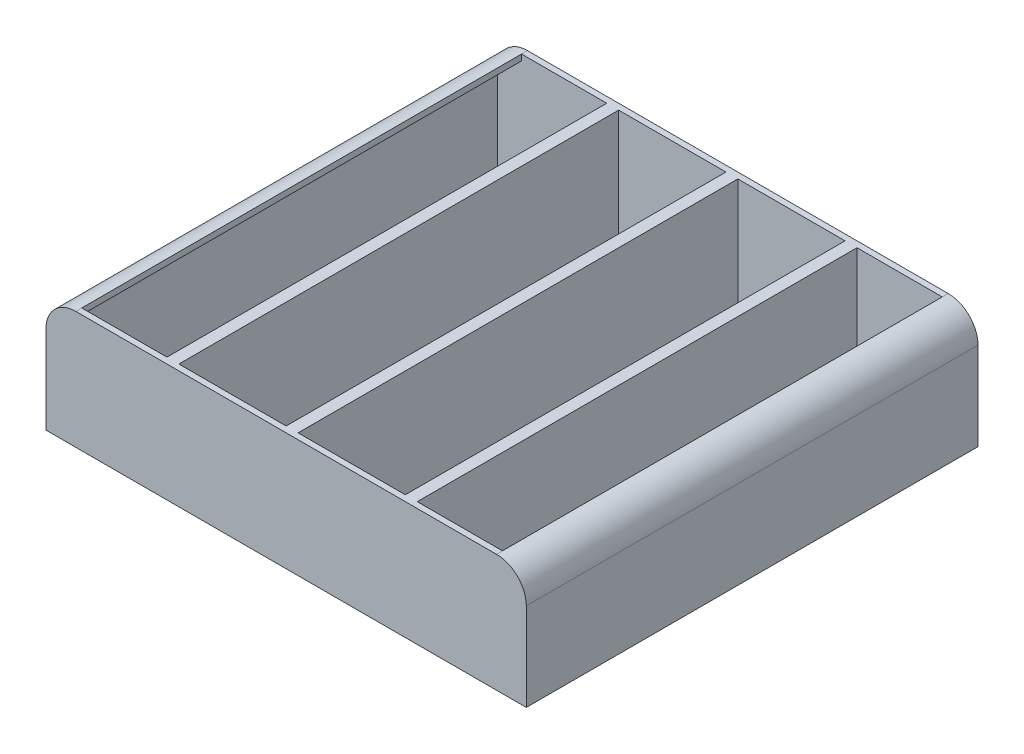
ISO-10303-21;
HEADER;
FILE_DESCRIPTION(('STEP AP214'),'2;1');
FILE_NAME('part.step','',(''),(''),'','','');
FILE_SCHEMA(('AUTOMOTIVE_DESIGN { 1 0 10303 214 1 1 1 1 }'));
ENDSEC;
DATA;
#1=APPLICATION_CONTEXT('core data for automotive mechanical design processes');
#2=APPLICATION_PROTOCOL_DEFINITION('international standard','automotive_design',2000,#1);
#3=PRODUCT_CONTEXT('',#1,'mechanical');
#4=PRODUCT('Part','Part','',(#3));
#5=PRODUCT_RELATED_PRODUCT_CATEGORY('part','',(#4));
#6=PRODUCT_DEFINITION_FORMATION('','',#4);
#7=PRODUCT_DEFINITION_CONTEXT('part definition',#1,'design');
#8=PRODUCT_DEFINITION('design','',#6,#7);
#9=PRODUCT_DEFINITION_SHAPE('','',#8);
#10=(LENGTH_UNIT() NAMED_UNIT(*) SI_UNIT(.MILLI.,.METRE.));
#11=(NAMED_UNIT(*) PLANE_ANGLE_UNIT() SI_UNIT($,.RADIAN.));
#12=(NAMED_UNIT(*) SI_UNIT($,.STERADIAN.) SOLID_ANGLE_UNIT());
#13=UNCERTAINTY_MEASURE_WITH_UNIT(LENGTH_MEASURE(1.E-05),#10,'distance_accuracy_value','');
#14=(GEOMETRIC_REPRESENTATION_CONTEXT(3) GLOBAL_UNCERTAINTY_ASSIGNED_CONTEXT((#13)) GLOBAL_UNIT_ASSIGNED_CONTEXT((#10,
#11,#12)) REPRESENTATION_CONTEXT('',''));
#15=CARTESIAN_POINT('',(0.,0.,0.));
#16=DIRECTION('',(0.,0.,1.));
#17=DIRECTION('',(1.,0.,0.));
#18=AXIS2_PLACEMENT_3D('',#15,#16,#17);
#19=CARTESIAN_POINT('',(-40.3,19.76,-37.9));
#20=DIRECTION('',(0.,0.,1.));
#21=DIRECTION('',(1.,0.,0.));
#22=AXIS2_PLACEMENT_3D('',#19,#20,#21);
#23=PLANE('',#22);
#24=DIRECTION('',(-1.,0.,0.));
#25=VECTOR('',#24,1.);
#26=CARTESIAN_POINT('',(-40.3,19.76,-37.9));
#27=LINE('',#26,#25);
#28=CARTESIAN_POINT('',(35.3,19.76,-37.9));
#29=VERTEX_POINT('',#28);
#30=CARTESIAN_POINT('',(-35.3,19.76,-37.9));
#31=VERTEX_POINT('',#30);
#32=EDGE_CURVE('E411',#29,#31,#27,.T.);
#33=ORIENTED_EDGE('',*,*,#32,.F.);
#34=CARTESIAN_POINT('',(35.3,14.76,-37.9));
#35=DIRECTION('',(0.,0.,1.));
#36=DIRECTION('',(1.,0.,0.));
#37=AXIS2_PLACEMENT_3D('',#34,#35,#36);
#38=CIRCLE('',#37,5.);
#39=CARTESIAN_POINT('',(40.3,14.76,-37.9));
#40=VERTEX_POINT('',#39);
#41=EDGE_CURVE('E273',#29,#40,#38,.F.);
#42=ORIENTED_EDGE('',*,*,#41,.T.);
#43=DIRECTION('',(0.,-1.,0.));
#44=VECTOR('',#43,1.);
#45=CARTESIAN_POINT('',(40.3,19.76,-37.9));
#46=LINE('',#45,#44);
#47=CARTESIAN_POINT('',(40.3,0.,-37.9));
#48=VERTEX_POINT('',#47);
#49=EDGE_CURVE('E279',#40,#48,#46,.T.);
#50=ORIENTED_EDGE('',*,*,#49,.T.);
#51=DIRECTION('',(-1.,0.,0.));
#52=VECTOR('',#51,1.);
#53=CARTESIAN_POINT('',(-40.3,0.,-37.9));
#54=LINE('',#53,#52);
#55=CARTESIAN_POINT('',(-40.3,0.,-37.9));
#56=VERTEX_POINT('',#55);
#57=EDGE_CURVE('E11',#48,#56,#54,.T.);
#58=ORIENTED_EDGE('',*,*,#57,.T.);
#59=DIRECTION('',(0.,-1.,0.));
#60=VECTOR('',#59,1.);
#61=CARTESIAN_POINT('',(-40.3,19.76,-37.9));
#62=LINE('',#61,#60);
#63=CARTESIAN_POINT('',(-40.3,14.76,-37.9));
#64=VERTEX_POINT('',#63);
#65=EDGE_CURVE('E404',#64,#56,#62,.T.);
#66=ORIENTED_EDGE('',*,*,#65,.F.);
#67=CARTESIAN_POINT('',(-35.3,14.76,-37.9));
#68=DIRECTION('',(0.,0.,1.));
#69=DIRECTION('',(1.,0.,0.));
#70=AXIS2_PLACEMENT_3D('',#67,#68,#69);
#71=CIRCLE('',#70,5.);
#72=EDGE_CURVE('E397',#64,#31,#71,.F.);
#73=ORIENTED_EDGE('',*,*,#72,.T.);
#74=EDGE_LOOP('',(#33,#42,#50,#58,#66,#73));
#75=FACE_BOUND('',#74,.T.);
#76=ADVANCED_FACE('F39',(#75),#23,.F.);
#77=CARTESIAN_POINT('',(-40.3,19.76,37.9));
#78=DIRECTION('',(0.,0.,-1.));
#79=DIRECTION('',(-1.,0.,0.));
#80=AXIS2_PLACEMENT_3D('',#77,#78,#79);
#81=PLANE('',#80);
#82=DIRECTION('',(1.,0.,0.));
#83=VECTOR('',#82,1.);
#84=CARTESIAN_POINT('',(-40.3,0.,37.9));
#85=LINE('',#84,#83);
#86=CARTESIAN_POINT('',(-40.3,0.,37.9));
#87=VERTEX_POINT('',#86);
#88=CARTESIAN_POINT('',(40.3,0.,37.9));
#89=VERTEX_POINT('',#88);
#90=EDGE_CURVE('E409',#87,#89,#85,.T.);
#91=ORIENTED_EDGE('',*,*,#90,.T.);
#92=DIRECTION('',(0.,-1.,0.));
#93=VECTOR('',#92,1.);
#94=CARTESIAN_POINT('',(40.3,19.76,37.9));
#95=LINE('',#94,#93);
#96=CARTESIAN_POINT('',(40.3,14.76,37.9));
#97=VERTEX_POINT('',#96);
#98=EDGE_CURVE('E281',#97,#89,#95,.T.);
#99=ORIENTED_EDGE('',*,*,#98,.F.);
#100=CARTESIAN_POINT('',(35.3,14.76,37.9));
#101=DIRECTION('',(0.,0.,-1.));
#102=DIRECTION('',(-1.,0.,0.));
#103=AXIS2_PLACEMENT_3D('',#100,#101,#102);
#104=CIRCLE('',#103,5.);
#105=CARTESIAN_POINT('',(35.3,19.76,37.9));
#106=VERTEX_POINT('',#105);
#107=EDGE_CURVE('E263',#97,#106,#104,.F.);
#108=ORIENTED_EDGE('',*,*,#107,.T.);
#109=DIRECTION('',(1.,0.,0.));
#110=VECTOR('',#109,1.);
#111=CARTESIAN_POINT('',(-40.3,19.76,37.9));
#112=LINE('',#111,#110);
#113=CARTESIAN_POINT('',(-35.3,19.76,37.9));
#114=VERTEX_POINT('',#113);
#115=EDGE_CURVE('E43',#114,#106,#112,.T.);
#116=ORIENTED_EDGE('',*,*,#115,.F.);
#117=CARTESIAN_POINT('',(-35.3,14.76,37.9));
#118=DIRECTION('',(0.,0.,-1.));
#119=DIRECTION('',(-1.,0.,0.));
#120=AXIS2_PLACEMENT_3D('',#117,#118,#119);
#121=CIRCLE('',#120,5.);
#122=CARTESIAN_POINT('',(-40.3,14.76,37.9));
#123=VERTEX_POINT('',#122);
#124=EDGE_CURVE('E395',#114,#123,#121,.F.);
#125=ORIENTED_EDGE('',*,*,#124,.T.);
#126=DIRECTION('',(0.,-1.,0.));
#127=VECTOR('',#126,1.);
#128=CARTESIAN_POINT('',(-40.3,19.76,37.9));
#129=LINE('',#128,#127);
#130=EDGE_CURVE('E406',#123,#87,#129,.T.);
#131=ORIENTED_EDGE('',*,*,#130,.T.);
#132=EDGE_LOOP('',(#91,#99,#108,#116,#125,#131));
#133=FACE_BOUND('',#132,.T.);
#134=ADVANCED_FACE('F424',(#133),#81,.F.);
#135=CARTESIAN_POINT('',(0.,19.76,0.));
#136=DIRECTION('',(0.,1.,0.));
#137=DIRECTION('',(0.,0.,1.));
#138=AXIS2_PLACEMENT_3D('',#135,#136,#137);
#139=PLANE('',#138);
#140=DIRECTION('',(1.,0.,0.));
#141=VECTOR('',#140,1.);
#142=CARTESIAN_POINT('',(-40.3,19.76,36.9));
#143=LINE('',#142,#141);
#144=CARTESIAN_POINT('',(-35.3,19.76,36.9));
#145=VERTEX_POINT('',#144);
#146=CARTESIAN_POINT('',(-21.,19.76,36.9));
#147=VERTEX_POINT('',#146);
#148=EDGE_CURVE('E381',#145,#147,#143,.T.);
#149=ORIENTED_EDGE('',*,*,#148,.F.);
#150=DIRECTION('',(0.,0.,1.));
#151=VECTOR('',#150,1.);
#152=CARTESIAN_POINT('',(-35.3,19.76,37.9));
#153=LINE('',#152,#151);
#154=EDGE_CURVE('E400',#145,#114,#153,.T.);
#155=ORIENTED_EDGE('',*,*,#154,.T.);
#156=ORIENTED_EDGE('',*,*,#115,.T.);
#157=DIRECTION('',(0.,0.,-1.));
#158=VECTOR('',#157,1.);
#159=CARTESIAN_POINT('',(35.3,19.76,-37.9));
#160=LINE('',#159,#158);
#161=CARTESIAN_POINT('',(35.3,19.76,36.9));
#162=VERTEX_POINT('',#161);
#163=EDGE_CURVE('E276',#106,#162,#160,.T.);
#164=ORIENTED_EDGE('',*,*,#163,.T.);
#165=DIRECTION('',(1.,0.,0.));
#166=VECTOR('',#165,1.);
#167=CARTESIAN_POINT('',(-40.3,19.76,36.9));
#168=LINE('',#167,#166);
#169=CARTESIAN_POINT('',(21.,19.76,36.9));
#170=VERTEX_POINT('',#169);
#171=EDGE_CURVE('E256',#170,#162,#168,.T.);
#172=ORIENTED_EDGE('',*,*,#171,.F.);
#173=DIRECTION('',(0.,0.,-1.));
#174=VECTOR('',#173,1.);
#175=CARTESIAN_POINT('',(21.,19.76,0.));
#176=LINE('',#175,#174);
#177=CARTESIAN_POINT('',(21.,19.76,-36.9));
#178=VERTEX_POINT('',#177);
#179=EDGE_CURVE('E233',#170,#178,#176,.T.);
#180=ORIENTED_EDGE('',*,*,#179,.T.);
#181=DIRECTION('',(-1.,0.,0.));
#182=VECTOR('',#181,1.);
#183=CARTESIAN_POINT('',(-40.3,19.76,-36.9));
#184=LINE('',#183,#182);
#185=CARTESIAN_POINT('',(35.3,19.76,-36.9));
#186=VERTEX_POINT('',#185);
#187=EDGE_CURVE('E231',#186,#178,#184,.T.);
#188=ORIENTED_EDGE('',*,*,#187,.F.);
#189=EDGE_CURVE('E275',#186,#29,#160,.T.);
#190=ORIENTED_EDGE('',*,*,#189,.T.);
#191=ORIENTED_EDGE('',*,*,#32,.T.);
#192=CARTESIAN_POINT('',(-35.3,19.76,-36.9));
#193=VERTEX_POINT('',#192);
#194=EDGE_CURVE('E401',#31,#193,#153,.T.);
#195=ORIENTED_EDGE('',*,*,#194,.T.);
#196=DIRECTION('',(-1.,0.,0.));
#197=VECTOR('',#196,1.);
#198=CARTESIAN_POINT('',(-40.3,19.76,-36.9));
#199=LINE('',#198,#197);
#200=CARTESIAN_POINT('',(-21.,19.76,-36.9));
#201=VERTEX_POINT('',#200);
#202=EDGE_CURVE('E375',#201,#193,#199,.T.);
#203=ORIENTED_EDGE('',*,*,#202,.F.);
#204=DIRECTION('',(0.,0.,-1.));
#205=VECTOR('',#204,1.);
#206=CARTESIAN_POINT('',(-21.,19.76,0.));
#207=LINE('',#206,#205);
#208=EDGE_CURVE('E362',#147,#201,#207,.T.);
#209=ORIENTED_EDGE('',*,*,#208,.F.);
#210=EDGE_LOOP('',(#149,#155,#156,#164,#172,#180,#188,#190,#191,#195,#203,#209));
#211=FACE_BOUND('',#210,.T.);
#212=DIRECTION('',(1.,0.,0.));
#213=VECTOR('',#212,1.);
#214=CARTESIAN_POINT('',(-40.3,19.76,36.9));
#215=LINE('',#214,#213);
#216=CARTESIAN_POINT('',(-19.,19.76,36.9));
#217=VERTEX_POINT('',#216);
#218=CARTESIAN_POINT('',(-1.,19.76,36.9));
#219=VERTEX_POINT('',#218);
#220=EDGE_CURVE('E325',#217,#219,#215,.T.);
#221=ORIENTED_EDGE('',*,*,#220,.F.);
#222=DIRECTION('',(0.,0.,-1.));
#223=VECTOR('',#222,1.);
#224=CARTESIAN_POINT('',(-19.,19.76,0.));
#225=LINE('',#224,#223);
#226=CARTESIAN_POINT('',(-19.,19.76,-36.9));
#227=VERTEX_POINT('',#226);
#228=EDGE_CURVE('E337',#217,#227,#225,.T.);
#229=ORIENTED_EDGE('',*,*,#228,.T.);
#230=DIRECTION('',(-1.,0.,0.));
#231=VECTOR('',#230,1.);
#232=CARTESIAN_POINT('',(-40.3,19.76,-36.9));
#233=LINE('',#232,#231);
#234=CARTESIAN_POINT('',(-1.,19.76,-36.9));
#235=VERTEX_POINT('',#234);
#236=EDGE_CURVE('E341',#235,#227,#233,.T.);
#237=ORIENTED_EDGE('',*,*,#236,.F.);
#238=DIRECTION('',(0.,0.,-1.));
#239=VECTOR('',#238,1.);
#240=CARTESIAN_POINT('',(-1.,19.76,0.));
#241=LINE('',#240,#239);
#242=EDGE_CURVE('E326',#219,#235,#241,.T.);
#243=ORIENTED_EDGE('',*,*,#242,.F.);
#244=EDGE_LOOP('',(#221,#229,#237,#243));
#245=FACE_BOUND('',#244,.T.);
#246=DIRECTION('',(1.,0.,0.));
#247=VECTOR('',#246,1.);
#248=CARTESIAN_POINT('',(-40.3,19.76,36.9));
#249=LINE('',#248,#247);
#250=CARTESIAN_POINT('',(1.,19.76,36.9));
#251=VERTEX_POINT('',#250);
#252=CARTESIAN_POINT('',(19.,19.76,36.9));
#253=VERTEX_POINT('',#252);
#254=EDGE_CURVE('E296',#251,#253,#249,.T.);
#255=ORIENTED_EDGE('',*,*,#254,.F.);
#256=DIRECTION('',(0.,0.,-1.));
#257=VECTOR('',#256,1.);
#258=CARTESIAN_POINT('',(1.,19.76,0.));
#259=LINE('',#258,#257);
#260=CARTESIAN_POINT('',(1.,19.76,-36.9));
#261=VERTEX_POINT('',#260);
#262=EDGE_CURVE('E306',#251,#261,#259,.T.);
#263=ORIENTED_EDGE('',*,*,#262,.T.);
#264=DIRECTION('',(-1.,0.,0.));
#265=VECTOR('',#264,1.);
#266=CARTESIAN_POINT('',(-40.3,19.76,-36.9));
#267=LINE('',#266,#265);
#268=CARTESIAN_POINT('',(19.,19.76,-36.9));
#269=VERTEX_POINT('',#268);
#270=EDGE_CURVE('E312',#269,#261,#267,.T.);
#271=ORIENTED_EDGE('',*,*,#270,.F.);
#272=DIRECTION('',(0.,0.,-1.));
#273=VECTOR('',#272,1.);
#274=CARTESIAN_POINT('',(19.,19.76,0.));
#275=LINE('',#274,#273);
#276=EDGE_CURVE('E295',#253,#269,#275,.T.);
#277=ORIENTED_EDGE('',*,*,#276,.F.);
#278=EDGE_LOOP('',(#255,#263,#271,#277));
#279=FACE_BOUND('',#278,.T.);
#280=ADVANCED_FACE('F41',(#211,#245,#279),#139,.T.);
#281=CARTESIAN_POINT('',(0.,0.,0.));
#282=DIRECTION('',(0.,1.,0.));
#283=DIRECTION('',(0.,0.,1.));
#284=AXIS2_PLACEMENT_3D('',#281,#282,#283);
#285=PLANE('',#284);
#286=ORIENTED_EDGE('',*,*,#57,.F.);
#287=DIRECTION('',(0.,0.,-1.));
#288=VECTOR('',#287,1.);
#289=CARTESIAN_POINT('',(40.3,0.,-37.9));
#290=LINE('',#289,#288);
#291=EDGE_CURVE('E284',#89,#48,#290,.T.);
#292=ORIENTED_EDGE('',*,*,#291,.F.);
#293=ORIENTED_EDGE('',*,*,#90,.F.);
#294=DIRECTION('',(0.,0.,1.));
#295=VECTOR('',#294,1.);
#296=CARTESIAN_POINT('',(-40.3,0.,-37.9));
#297=LINE('',#296,#295);
#298=EDGE_CURVE('E48',#56,#87,#297,.T.);
#299=ORIENTED_EDGE('',*,*,#298,.F.);
#300=EDGE_LOOP('',(#286,#292,#293,#299));
#301=FACE_BOUND('',#300,.T.);
#302=ADVANCED_FACE('F463',(#301),#285,.F.);
#303=CARTESIAN_POINT('',(-40.3,19.76,-37.9));
#304=DIRECTION('',(1.,0.,0.));
#305=DIRECTION('',(0.,0.,-1.));
#306=AXIS2_PLACEMENT_3D('',#303,#304,#305);
#307=PLANE('',#306);
#308=ORIENTED_EDGE('',*,*,#130,.F.);
#309=DIRECTION('',(0.,0.,1.));
#310=VECTOR('',#309,1.);
#311=CARTESIAN_POINT('',(-40.3,14.76,-37.9));
#312=LINE('',#311,#310);
#313=EDGE_CURVE('E386',#123,#64,#312,.F.);
#314=ORIENTED_EDGE('',*,*,#313,.T.);
#315=ORIENTED_EDGE('',*,*,#65,.T.);
#316=ORIENTED_EDGE('',*,*,#298,.T.);
#317=EDGE_LOOP('',(#308,#314,#315,#316));
#318=FACE_BOUND('',#317,.T.);
#319=ADVANCED_FACE('F461',(#318),#307,.F.);
#320=CARTESIAN_POINT('',(-35.3,14.76,0.));
#321=DIRECTION('',(0.,0.,-1.));
#322=DIRECTION('',(-1.,0.,0.));
#323=AXIS2_PLACEMENT_3D('',#320,#321,#322);
#324=CYLINDRICAL_SURFACE('',#323,5.);
#325=ORIENTED_EDGE('',*,*,#72,.F.);
#326=ORIENTED_EDGE('',*,*,#313,.F.);
#327=ORIENTED_EDGE('',*,*,#124,.F.);
#328=ORIENTED_EDGE('',*,*,#154,.F.);
#329=DIRECTION('',(0.,0.,1.));
#330=VECTOR('',#329,1.);
#331=CARTESIAN_POINT('',(-35.3,19.76,37.9));
#332=LINE('',#331,#330);
#333=EDGE_CURVE('E350',#193,#145,#332,.T.);
#334=ORIENTED_EDGE('',*,*,#333,.F.);
#335=ORIENTED_EDGE('',*,*,#194,.F.);
#336=EDGE_LOOP('',(#325,#326,#327,#328,#334,#335));
#337=FACE_BOUND('',#336,.T.);
#338=ADVANCED_FACE('F470',(#337),#324,.T.);
#339=CARTESIAN_POINT('',(-35.3,19.76,37.9));
#340=DIRECTION('',(-1.,0.,0.));
#341=DIRECTION('',(0.,0.,1.));
#342=AXIS2_PLACEMENT_3D('',#339,#340,#341);
#343=PLANE('',#342);
#344=ORIENTED_EDGE('',*,*,#333,.T.);
#345=DIRECTION('',(0.,-1.,0.));
#346=VECTOR('',#345,1.);
#347=CARTESIAN_POINT('',(-35.3,19.76,36.9));
#348=LINE('',#347,#346);
#349=CARTESIAN_POINT('',(-35.3,18.76,36.9));
#350=VERTEX_POINT('',#349);
#351=EDGE_CURVE('E387',#350,#145,#348,.F.);
#352=ORIENTED_EDGE('',*,*,#351,.F.);
#353=DIRECTION('',(0.,0.,-1.));
#354=VECTOR('',#353,1.);
#355=CARTESIAN_POINT('',(-35.3,18.76,0.));
#356=LINE('',#355,#354);
#357=CARTESIAN_POINT('',(-35.3,18.76,-36.9));
#358=VERTEX_POINT('',#357);
#359=EDGE_CURVE('E365',#358,#350,#356,.F.);
#360=ORIENTED_EDGE('',*,*,#359,.F.);
#361=DIRECTION('',(0.,1.,0.));
#362=VECTOR('',#361,1.);
#363=CARTESIAN_POINT('',(-35.3,19.76,-36.9));
#364=LINE('',#363,#362);
#365=EDGE_CURVE('E56',#358,#193,#364,.T.);
#366=ORIENTED_EDGE('',*,*,#365,.T.);
#367=EDGE_LOOP('',(#344,#352,#360,#366));
#368=FACE_BOUND('',#367,.T.);
#369=ADVANCED_FACE('F529',(#368),#343,.F.);
#370=CARTESIAN_POINT('',(-21.,0.,0.));
#371=DIRECTION('',(1.,0.,0.));
#372=DIRECTION('',(0.,0.,-1.));
#373=AXIS2_PLACEMENT_3D('',#370,#371,#372);
#374=PLANE('',#373);
#375=ORIENTED_EDGE('',*,*,#208,.T.);
#376=DIRECTION('',(0.,1.,0.));
#377=VECTOR('',#376,1.);
#378=CARTESIAN_POINT('',(-21.,19.76,-36.9));
#379=LINE('',#378,#377);
#380=CARTESIAN_POINT('',(-21.,1.,-36.9));
#381=VERTEX_POINT('',#380);
#382=EDGE_CURVE('E357',#381,#201,#379,.T.);
#383=ORIENTED_EDGE('',*,*,#382,.F.);
#384=DIRECTION('',(0.,0.,-1.));
#385=VECTOR('',#384,1.);
#386=CARTESIAN_POINT('',(-21.,1.,0.));
#387=LINE('',#386,#385);
#388=CARTESIAN_POINT('',(-21.,1.,36.9));
#389=VERTEX_POINT('',#388);
#390=EDGE_CURVE('E331',#389,#381,#387,.T.);
#391=ORIENTED_EDGE('',*,*,#390,.F.);
#392=DIRECTION('',(0.,-1.,0.));
#393=VECTOR('',#392,1.);
#394=CARTESIAN_POINT('',(-21.,19.76,36.9));
#395=LINE('',#394,#393);
#396=EDGE_CURVE('E354',#147,#389,#395,.T.);
#397=ORIENTED_EDGE('',*,*,#396,.F.);
#398=EDGE_LOOP('',(#375,#383,#391,#397));
#399=FACE_BOUND('',#398,.T.);
#400=ADVANCED_FACE('F513',(#399),#374,.F.);
#401=CARTESIAN_POINT('',(-40.3,19.76,-36.9));
#402=DIRECTION('',(0.,0.,1.));
#403=DIRECTION('',(1.,0.,0.));
#404=AXIS2_PLACEMENT_3D('',#401,#402,#403);
#405=PLANE('',#404);
#406=ORIENTED_EDGE('',*,*,#382,.T.);
#407=ORIENTED_EDGE('',*,*,#202,.T.);
#408=ORIENTED_EDGE('',*,*,#365,.F.);
#409=CARTESIAN_POINT('',(-35.3,14.76,-36.9));
#410=DIRECTION('',(0.,0.,1.));
#411=DIRECTION('',(1.,0.,0.));
#412=AXIS2_PLACEMENT_3D('',#409,#410,#411);
#413=CIRCLE('',#412,4.);
#414=CARTESIAN_POINT('',(-39.3,14.76,-36.9));
#415=VERTEX_POINT('',#414);
#416=EDGE_CURVE('E353',#415,#358,#413,.F.);
#417=ORIENTED_EDGE('',*,*,#416,.F.);
#418=DIRECTION('',(0.,-1.,0.));
#419=VECTOR('',#418,1.);
#420=CARTESIAN_POINT('',(-39.3,19.76,-36.9));
#421=LINE('',#420,#419);
#422=CARTESIAN_POINT('',(-39.3,1.,-36.9));
#423=VERTEX_POINT('',#422);
#424=EDGE_CURVE('E352',#415,#423,#421,.T.);
#425=ORIENTED_EDGE('',*,*,#424,.T.);
#426=DIRECTION('',(-1.,0.,0.));
#427=VECTOR('',#426,1.);
#428=CARTESIAN_POINT('',(-40.3,1.,-36.9));
#429=LINE('',#428,#427);
#430=EDGE_CURVE('E363',#381,#423,#429,.T.);
#431=ORIENTED_EDGE('',*,*,#430,.F.);
#432=EDGE_LOOP('',(#406,#407,#408,#417,#425,#431));
#433=FACE_BOUND('',#432,.T.);
#434=ADVANCED_FACE('F532',(#433),#405,.T.);
#435=CARTESIAN_POINT('',(-40.3,19.76,36.9));
#436=DIRECTION('',(0.,0.,-1.));
#437=DIRECTION('',(-1.,0.,0.));
#438=AXIS2_PLACEMENT_3D('',#435,#436,#437);
#439=PLANE('',#438);
#440=ORIENTED_EDGE('',*,*,#396,.T.);
#441=DIRECTION('',(1.,0.,0.));
#442=VECTOR('',#441,1.);
#443=CARTESIAN_POINT('',(-40.3,1.,36.9));
#444=LINE('',#443,#442);
#445=CARTESIAN_POINT('',(-39.3,1.,36.9));
#446=VERTEX_POINT('',#445);
#447=EDGE_CURVE('E373',#446,#389,#444,.T.);
#448=ORIENTED_EDGE('',*,*,#447,.F.);
#449=DIRECTION('',(0.,-1.,0.));
#450=VECTOR('',#449,1.);
#451=CARTESIAN_POINT('',(-39.3,19.76,36.9));
#452=LINE('',#451,#450);
#453=CARTESIAN_POINT('',(-39.3,14.76,36.9));
#454=VERTEX_POINT('',#453);
#455=EDGE_CURVE('E369',#454,#446,#452,.T.);
#456=ORIENTED_EDGE('',*,*,#455,.F.);
#457=CARTESIAN_POINT('',(-35.3,14.76,36.9));
#458=DIRECTION('',(0.,0.,-1.));
#459=DIRECTION('',(-1.,0.,0.));
#460=AXIS2_PLACEMENT_3D('',#457,#458,#459);
#461=CIRCLE('',#460,4.);
#462=EDGE_CURVE('E372',#350,#454,#461,.F.);
#463=ORIENTED_EDGE('',*,*,#462,.F.);
#464=ORIENTED_EDGE('',*,*,#351,.T.);
#465=ORIENTED_EDGE('',*,*,#148,.T.);
#466=EDGE_LOOP('',(#440,#448,#456,#463,#464,#465));
#467=FACE_BOUND('',#466,.T.);
#468=ADVANCED_FACE('F538',(#467),#439,.T.);
#469=CARTESIAN_POINT('',(0.,1.,0.));
#470=DIRECTION('',(0.,1.,0.));
#471=DIRECTION('',(0.,0.,1.));
#472=AXIS2_PLACEMENT_3D('',#469,#470,#471);
#473=PLANE('',#472);
#474=ORIENTED_EDGE('',*,*,#390,.T.);
#475=ORIENTED_EDGE('',*,*,#430,.T.);
#476=DIRECTION('',(0.,0.,1.));
#477=VECTOR('',#476,1.);
#478=CARTESIAN_POINT('',(-39.3,1.,-37.9));
#479=LINE('',#478,#477);
#480=EDGE_CURVE('E366',#423,#446,#479,.T.);
#481=ORIENTED_EDGE('',*,*,#480,.T.);
#482=ORIENTED_EDGE('',*,*,#447,.T.);
#483=EDGE_LOOP('',(#474,#475,#481,#482));
#484=FACE_BOUND('',#483,.T.);
#485=ADVANCED_FACE('F542',(#484),#473,.T.);
#486=CARTESIAN_POINT('',(-39.3,19.76,-37.9));
#487=DIRECTION('',(1.,0.,0.));
#488=DIRECTION('',(0.,0.,-1.));
#489=AXIS2_PLACEMENT_3D('',#486,#487,#488);
#490=PLANE('',#489);
#491=ORIENTED_EDGE('',*,*,#455,.T.);
#492=ORIENTED_EDGE('',*,*,#480,.F.);
#493=ORIENTED_EDGE('',*,*,#424,.F.);
#494=DIRECTION('',(0.,0.,-1.));
#495=VECTOR('',#494,1.);
#496=CARTESIAN_POINT('',(-39.3,14.76,-37.9));
#497=LINE('',#496,#495);
#498=EDGE_CURVE('E379',#454,#415,#497,.T.);
#499=ORIENTED_EDGE('',*,*,#498,.F.);
#500=EDGE_LOOP('',(#491,#492,#493,#499));
#501=FACE_BOUND('',#500,.T.);
#502=ADVANCED_FACE('F546',(#501),#490,.T.);
#503=CARTESIAN_POINT('',(-35.3,14.76,0.));
#504=DIRECTION('',(0.,0.,-1.));
#505=DIRECTION('',(-1.,0.,0.));
#506=AXIS2_PLACEMENT_3D('',#503,#504,#505);
#507=CYLINDRICAL_SURFACE('',#506,4.);
#508=ORIENTED_EDGE('',*,*,#416,.T.);
#509=ORIENTED_EDGE('',*,*,#359,.T.);
#510=ORIENTED_EDGE('',*,*,#462,.T.);
#511=ORIENTED_EDGE('',*,*,#498,.T.);
#512=EDGE_LOOP('',(#508,#509,#510,#511));
#513=FACE_BOUND('',#512,.T.);
#514=ADVANCED_FACE('F511',(#513),#507,.F.);
#515=CARTESIAN_POINT('',(-19.,0.,0.));
#516=DIRECTION('',(1.,0.,0.));
#517=DIRECTION('',(0.,0.,-1.));
#518=AXIS2_PLACEMENT_3D('',#515,#516,#517);
#519=PLANE('',#518);
#520=ORIENTED_EDGE('',*,*,#228,.F.);
#521=DIRECTION('',(0.,-1.,0.));
#522=VECTOR('',#521,1.);
#523=CARTESIAN_POINT('',(-19.,19.76,36.9));
#524=LINE('',#523,#522);
#525=CARTESIAN_POINT('',(-19.,1.,36.9));
#526=VERTEX_POINT('',#525);
#527=EDGE_CURVE('E321',#217,#526,#524,.T.);
#528=ORIENTED_EDGE('',*,*,#527,.T.);
#529=DIRECTION('',(0.,0.,-1.));
#530=VECTOR('',#529,1.);
#531=CARTESIAN_POINT('',(-19.,1.,0.));
#532=LINE('',#531,#530);
#533=CARTESIAN_POINT('',(-19.,1.,-36.9));
#534=VERTEX_POINT('',#533);
#535=EDGE_CURVE('E323',#526,#534,#532,.T.);
#536=ORIENTED_EDGE('',*,*,#535,.T.);
#537=DIRECTION('',(0.,1.,0.));
#538=VECTOR('',#537,1.);
#539=CARTESIAN_POINT('',(-19.,19.76,-36.9));
#540=LINE('',#539,#538);
#541=EDGE_CURVE('E319',#534,#227,#540,.T.);
#542=ORIENTED_EDGE('',*,*,#541,.T.);
#543=EDGE_LOOP('',(#520,#528,#536,#542));
#544=FACE_BOUND('',#543,.T.);
#545=ADVANCED_FACE('F507',(#544),#519,.T.);
#546=CARTESIAN_POINT('',(-1.,0.,0.));
#547=DIRECTION('',(1.,0.,0.));
#548=DIRECTION('',(0.,0.,-1.));
#549=AXIS2_PLACEMENT_3D('',#546,#547,#548);
#550=PLANE('',#549);
#551=ORIENTED_EDGE('',*,*,#242,.T.);
#552=DIRECTION('',(0.,1.,0.));
#553=VECTOR('',#552,1.);
#554=CARTESIAN_POINT('',(-1.,19.76,-36.9));
#555=LINE('',#554,#553);
#556=CARTESIAN_POINT('',(-1.,1.,-36.9));
#557=VERTEX_POINT('',#556);
#558=EDGE_CURVE('E322',#557,#235,#555,.T.);
#559=ORIENTED_EDGE('',*,*,#558,.F.);
#560=DIRECTION('',(0.,0.,-1.));
#561=VECTOR('',#560,1.);
#562=CARTESIAN_POINT('',(-1.,1.,0.));
#563=LINE('',#562,#561);
#564=CARTESIAN_POINT('',(-1.,1.,36.9));
#565=VERTEX_POINT('',#564);
#566=EDGE_CURVE('E310',#565,#557,#563,.T.);
#567=ORIENTED_EDGE('',*,*,#566,.F.);
#568=DIRECTION('',(0.,-1.,0.));
#569=VECTOR('',#568,1.);
#570=CARTESIAN_POINT('',(-1.,19.76,36.9));
#571=LINE('',#570,#569);
#572=EDGE_CURVE('E334',#219,#565,#571,.T.);
#573=ORIENTED_EDGE('',*,*,#572,.F.);
#574=EDGE_LOOP('',(#551,#559,#567,#573));
#575=FACE_BOUND('',#574,.T.);
#576=ADVANCED_FACE('F510',(#575),#550,.F.);
#577=CARTESIAN_POINT('',(-40.3,19.76,-36.9));
#578=DIRECTION('',(0.,0.,1.));
#579=DIRECTION('',(1.,0.,0.));
#580=AXIS2_PLACEMENT_3D('',#577,#578,#579);
#581=PLANE('',#580);
#582=DIRECTION('',(-1.,0.,0.));
#583=VECTOR('',#582,1.);
#584=CARTESIAN_POINT('',(-40.3,1.,-36.9));
#585=LINE('',#584,#583);
#586=EDGE_CURVE('E328',#557,#534,#585,.T.);
#587=ORIENTED_EDGE('',*,*,#586,.F.);
#588=ORIENTED_EDGE('',*,*,#558,.T.);
#589=ORIENTED_EDGE('',*,*,#236,.T.);
#590=ORIENTED_EDGE('',*,*,#541,.F.);
#591=EDGE_LOOP('',(#587,#588,#589,#590));
#592=FACE_BOUND('',#591,.T.);
#593=ADVANCED_FACE('F516',(#592),#581,.T.);
#594=CARTESIAN_POINT('',(-40.3,19.76,36.9));
#595=DIRECTION('',(0.,0.,-1.));
#596=DIRECTION('',(-1.,0.,0.));
#597=AXIS2_PLACEMENT_3D('',#594,#595,#596);
#598=PLANE('',#597);
#599=ORIENTED_EDGE('',*,*,#220,.T.);
#600=ORIENTED_EDGE('',*,*,#572,.T.);
#601=DIRECTION('',(1.,0.,0.));
#602=VECTOR('',#601,1.);
#603=CARTESIAN_POINT('',(-40.3,1.,36.9));
#604=LINE('',#603,#602);
#605=EDGE_CURVE('E332',#526,#565,#604,.T.);
#606=ORIENTED_EDGE('',*,*,#605,.F.);
#607=ORIENTED_EDGE('',*,*,#527,.F.);
#608=EDGE_LOOP('',(#599,#600,#606,#607));
#609=FACE_BOUND('',#608,.T.);
#610=ADVANCED_FACE('F521',(#609),#598,.T.);
#611=CARTESIAN_POINT('',(0.,1.,0.));
#612=DIRECTION('',(0.,1.,0.));
#613=DIRECTION('',(0.,0.,1.));
#614=AXIS2_PLACEMENT_3D('',#611,#612,#613);
#615=PLANE('',#614);
#616=ORIENTED_EDGE('',*,*,#605,.T.);
#617=ORIENTED_EDGE('',*,*,#566,.T.);
#618=ORIENTED_EDGE('',*,*,#586,.T.);
#619=ORIENTED_EDGE('',*,*,#535,.F.);
#620=EDGE_LOOP('',(#616,#617,#618,#619));
#621=FACE_BOUND('',#620,.T.);
#622=ADVANCED_FACE('F518',(#621),#615,.T.);
#623=CARTESIAN_POINT('',(1.,0.,0.));
#624=DIRECTION('',(1.,0.,0.));
#625=DIRECTION('',(0.,0.,-1.));
#626=AXIS2_PLACEMENT_3D('',#623,#624,#625);
#627=PLANE('',#626);
#628=ORIENTED_EDGE('',*,*,#262,.F.);
#629=DIRECTION('',(0.,-1.,0.));
#630=VECTOR('',#629,1.);
#631=CARTESIAN_POINT('',(1.,19.76,36.9));
#632=LINE('',#631,#630);
#633=CARTESIAN_POINT('',(1.,1.,36.9));
#634=VERTEX_POINT('',#633);
#635=EDGE_CURVE('E292',#251,#634,#632,.T.);
#636=ORIENTED_EDGE('',*,*,#635,.T.);
#637=DIRECTION('',(0.,0.,-1.));
#638=VECTOR('',#637,1.);
#639=CARTESIAN_POINT('',(1.,1.,0.));
#640=LINE('',#639,#638);
#641=CARTESIAN_POINT('',(1.,1.,-36.9));
#642=VERTEX_POINT('',#641);
#643=EDGE_CURVE('E293',#634,#642,#640,.T.);
#644=ORIENTED_EDGE('',*,*,#643,.T.);
#645=DIRECTION('',(0.,1.,0.));
#646=VECTOR('',#645,1.);
#647=CARTESIAN_POINT('',(1.,19.76,-36.9));
#648=LINE('',#647,#646);
#649=EDGE_CURVE('E288',#642,#261,#648,.T.);
#650=ORIENTED_EDGE('',*,*,#649,.T.);
#651=EDGE_LOOP('',(#628,#636,#644,#650));
#652=FACE_BOUND('',#651,.T.);
#653=ADVANCED_FACE('F500',(#652),#627,.T.);
#654=CARTESIAN_POINT('',(19.,0.,0.));
#655=DIRECTION('',(1.,0.,0.));
#656=DIRECTION('',(0.,0.,-1.));
#657=AXIS2_PLACEMENT_3D('',#654,#655,#656);
#658=PLANE('',#657);
#659=ORIENTED_EDGE('',*,*,#276,.T.);
#660=DIRECTION('',(0.,1.,0.));
#661=VECTOR('',#660,1.);
#662=CARTESIAN_POINT('',(19.,19.76,-36.9));
#663=LINE('',#662,#661);
#664=CARTESIAN_POINT('',(19.,1.,-36.9));
#665=VERTEX_POINT('',#664);
#666=EDGE_CURVE('E291',#665,#269,#663,.T.);
#667=ORIENTED_EDGE('',*,*,#666,.F.);
#668=DIRECTION('',(0.,0.,-1.));
#669=VECTOR('',#668,1.);
#670=CARTESIAN_POINT('',(19.,1.,0.));
#671=LINE('',#670,#669);
#672=CARTESIAN_POINT('',(19.,1.,36.9));
#673=VERTEX_POINT('',#672);
#674=EDGE_CURVE('E307',#673,#665,#671,.T.);
#675=ORIENTED_EDGE('',*,*,#674,.F.);
#676=DIRECTION('',(0.,-1.,0.));
#677=VECTOR('',#676,1.);
#678=CARTESIAN_POINT('',(19.,19.76,36.9));
#679=LINE('',#678,#677);
#680=EDGE_CURVE('E300',#253,#673,#679,.T.);
#681=ORIENTED_EDGE('',*,*,#680,.F.);
#682=EDGE_LOOP('',(#659,#667,#675,#681));
#683=FACE_BOUND('',#682,.T.);
#684=ADVANCED_FACE('F491',(#683),#658,.F.);
#685=CARTESIAN_POINT('',(-40.3,19.76,-36.9));
#686=DIRECTION('',(0.,0.,1.));
#687=DIRECTION('',(1.,0.,0.));
#688=AXIS2_PLACEMENT_3D('',#685,#686,#687);
#689=PLANE('',#688);
#690=ORIENTED_EDGE('',*,*,#666,.T.);
#691=ORIENTED_EDGE('',*,*,#270,.T.);
#692=ORIENTED_EDGE('',*,*,#649,.F.);
#693=DIRECTION('',(-1.,0.,0.));
#694=VECTOR('',#693,1.);
#695=CARTESIAN_POINT('',(-40.3,1.,-36.9));
#696=LINE('',#695,#694);
#697=EDGE_CURVE('E287',#665,#642,#696,.T.);
#698=ORIENTED_EDGE('',*,*,#697,.F.);
#699=EDGE_LOOP('',(#690,#691,#692,#698));
#700=FACE_BOUND('',#699,.T.);
#701=ADVANCED_FACE('F480',(#700),#689,.T.);
#702=CARTESIAN_POINT('',(-40.3,19.76,36.9));
#703=DIRECTION('',(0.,0.,-1.));
#704=DIRECTION('',(-1.,0.,0.));
#705=AXIS2_PLACEMENT_3D('',#702,#703,#704);
#706=PLANE('',#705);
#707=ORIENTED_EDGE('',*,*,#680,.T.);
#708=DIRECTION('',(1.,0.,0.));
#709=VECTOR('',#708,1.);
#710=CARTESIAN_POINT('',(-40.3,1.,36.9));
#711=LINE('',#710,#709);
#712=EDGE_CURVE('E303',#634,#673,#711,.T.);
#713=ORIENTED_EDGE('',*,*,#712,.F.);
#714=ORIENTED_EDGE('',*,*,#635,.F.);
#715=ORIENTED_EDGE('',*,*,#254,.T.);
#716=EDGE_LOOP('',(#707,#713,#714,#715));
#717=FACE_BOUND('',#716,.T.);
#718=ADVANCED_FACE('F490',(#717),#706,.T.);
#719=CARTESIAN_POINT('',(0.,1.,0.));
#720=DIRECTION('',(0.,1.,0.));
#721=DIRECTION('',(0.,0.,1.));
#722=AXIS2_PLACEMENT_3D('',#719,#720,#721);
#723=PLANE('',#722);
#724=ORIENTED_EDGE('',*,*,#674,.T.);
#725=ORIENTED_EDGE('',*,*,#697,.T.);
#726=ORIENTED_EDGE('',*,*,#643,.F.);
#727=ORIENTED_EDGE('',*,*,#712,.T.);
#728=EDGE_LOOP('',(#724,#725,#726,#727));
#729=FACE_BOUND('',#728,.T.);
#730=ADVANCED_FACE('F486',(#729),#723,.T.);
#731=CARTESIAN_POINT('',(35.3,14.76,0.));
#732=DIRECTION('',(0.,0.,1.));
#733=DIRECTION('',(1.,0.,0.));
#734=AXIS2_PLACEMENT_3D('',#731,#732,#733);
#735=CYLINDRICAL_SURFACE('',#734,5.);
#736=ORIENTED_EDGE('',*,*,#107,.F.);
#737=DIRECTION('',(0.,0.,-1.));
#738=VECTOR('',#737,1.);
#739=CARTESIAN_POINT('',(40.3,14.76,37.9));
#740=LINE('',#739,#738);
#741=EDGE_CURVE('E271',#40,#97,#740,.F.);
#742=ORIENTED_EDGE('',*,*,#741,.F.);
#743=ORIENTED_EDGE('',*,*,#41,.F.);
#744=ORIENTED_EDGE('',*,*,#189,.F.);
#745=DIRECTION('',(0.,0.,-1.));
#746=VECTOR('',#745,1.);
#747=CARTESIAN_POINT('',(35.3,19.76,-37.9));
#748=LINE('',#747,#746);
#749=EDGE_CURVE('E247',#162,#186,#748,.T.);
#750=ORIENTED_EDGE('',*,*,#749,.F.);
#751=ORIENTED_EDGE('',*,*,#163,.F.);
#752=EDGE_LOOP('',(#736,#742,#743,#744,#750,#751));
#753=FACE_BOUND('',#752,.T.);
#754=ADVANCED_FACE('F428',(#753),#735,.T.);
#755=CARTESIAN_POINT('',(40.3,19.76,-37.9));
#756=DIRECTION('',(-1.,0.,0.));
#757=DIRECTION('',(0.,0.,1.));
#758=AXIS2_PLACEMENT_3D('',#755,#756,#757);
#759=PLANE('',#758);
#760=ORIENTED_EDGE('',*,*,#49,.F.);
#761=ORIENTED_EDGE('',*,*,#741,.T.);
#762=ORIENTED_EDGE('',*,*,#98,.T.);
#763=ORIENTED_EDGE('',*,*,#291,.T.);
#764=EDGE_LOOP('',(#760,#761,#762,#763));
#765=FACE_BOUND('',#764,.T.);
#766=ADVANCED_FACE('F477',(#765),#759,.F.);
#767=CARTESIAN_POINT('',(35.3,19.76,-37.9));
#768=DIRECTION('',(1.,0.,0.));
#769=DIRECTION('',(0.,0.,-1.));
#770=AXIS2_PLACEMENT_3D('',#767,#768,#769);
#771=PLANE('',#770);
#772=ORIENTED_EDGE('',*,*,#749,.T.);
#773=DIRECTION('',(0.,-1.,0.));
#774=VECTOR('',#773,1.);
#775=CARTESIAN_POINT('',(35.3,19.76,-36.9));
#776=LINE('',#775,#774);
#777=CARTESIAN_POINT('',(35.3,18.76,-36.9));
#778=VERTEX_POINT('',#777);
#779=EDGE_CURVE('E264',#778,#186,#776,.F.);
#780=ORIENTED_EDGE('',*,*,#779,.F.);
#781=DIRECTION('',(0.,0.,1.));
#782=VECTOR('',#781,1.);
#783=CARTESIAN_POINT('',(35.3,18.76,0.));
#784=LINE('',#783,#782);
#785=CARTESIAN_POINT('',(35.3,18.76,36.9));
#786=VERTEX_POINT('',#785);
#787=EDGE_CURVE('E240',#786,#778,#784,.F.);
#788=ORIENTED_EDGE('',*,*,#787,.F.);
#789=DIRECTION('',(0.,1.,0.));
#790=VECTOR('',#789,1.);
#791=CARTESIAN_POINT('',(35.3,19.76,36.9));
#792=LINE('',#791,#790);
#793=EDGE_CURVE('E260',#786,#162,#792,.T.);
#794=ORIENTED_EDGE('',*,*,#793,.T.);
#795=EDGE_LOOP('',(#772,#780,#788,#794));
#796=FACE_BOUND('',#795,.T.);
#797=ADVANCED_FACE('F434',(#796),#771,.F.);
#798=CARTESIAN_POINT('',(21.,0.,0.));
#799=DIRECTION('',(1.,0.,0.));
#800=DIRECTION('',(0.,0.,-1.));
#801=AXIS2_PLACEMENT_3D('',#798,#799,#800);
#802=PLANE('',#801);
#803=ORIENTED_EDGE('',*,*,#179,.F.);
#804=DIRECTION('',(0.,-1.,0.));
#805=VECTOR('',#804,1.);
#806=CARTESIAN_POINT('',(21.,19.76,36.9));
#807=LINE('',#806,#805);
#808=CARTESIAN_POINT('',(21.,1.,36.9));
#809=VERTEX_POINT('',#808);
#810=EDGE_CURVE('E218',#170,#809,#807,.T.);
#811=ORIENTED_EDGE('',*,*,#810,.T.);
#812=DIRECTION('',(0.,0.,-1.));
#813=VECTOR('',#812,1.);
#814=CARTESIAN_POINT('',(21.,1.,0.));
#815=LINE('',#814,#813);
#816=CARTESIAN_POINT('',(21.,1.,-36.9));
#817=VERTEX_POINT('',#816);
#818=EDGE_CURVE('E212',#809,#817,#815,.T.);
#819=ORIENTED_EDGE('',*,*,#818,.T.);
#820=DIRECTION('',(0.,1.,0.));
#821=VECTOR('',#820,1.);
#822=CARTESIAN_POINT('',(21.,19.76,-36.9));
#823=LINE('',#822,#821);
#824=EDGE_CURVE('E216',#817,#178,#823,.T.);
#825=ORIENTED_EDGE('',*,*,#824,.T.);
#826=EDGE_LOOP('',(#803,#811,#819,#825));
#827=FACE_BOUND('',#826,.T.);
#828=ADVANCED_FACE('F215',(#827),#802,.T.);
#829=CARTESIAN_POINT('',(35.3,14.76,0.));
#830=DIRECTION('',(0.,0.,1.));
#831=DIRECTION('',(1.,0.,0.));
#832=AXIS2_PLACEMENT_3D('',#829,#830,#831);
#833=CYLINDRICAL_SURFACE('',#832,4.);
#834=CARTESIAN_POINT('',(35.3,14.76,36.9));
#835=DIRECTION('',(0.,0.,-1.));
#836=DIRECTION('',(-1.,0.,0.));
#837=AXIS2_PLACEMENT_3D('',#834,#835,#836);
#838=CIRCLE('',#837,4.);
#839=CARTESIAN_POINT('',(39.3,14.76,36.9));
#840=VERTEX_POINT('',#839);
#841=EDGE_CURVE('E222',#840,#786,#838,.F.);
#842=ORIENTED_EDGE('',*,*,#841,.T.);
#843=ORIENTED_EDGE('',*,*,#787,.T.);
#844=CARTESIAN_POINT('',(35.3,14.76,-36.9));
#845=DIRECTION('',(0.,0.,1.));
#846=DIRECTION('',(1.,0.,0.));
#847=AXIS2_PLACEMENT_3D('',#844,#845,#846);
#848=CIRCLE('',#847,4.);
#849=CARTESIAN_POINT('',(39.3,14.76,-36.9));
#850=VERTEX_POINT('',#849);
#851=EDGE_CURVE('E245',#778,#850,#848,.F.);
#852=ORIENTED_EDGE('',*,*,#851,.T.);
#853=DIRECTION('',(0.,0.,1.));
#854=VECTOR('',#853,1.);
#855=CARTESIAN_POINT('',(39.3,14.76,-37.9));
#856=LINE('',#855,#854);
#857=EDGE_CURVE('E248',#850,#840,#856,.T.);
#858=ORIENTED_EDGE('',*,*,#857,.T.);
#859=EDGE_LOOP('',(#842,#843,#852,#858));
#860=FACE_BOUND('',#859,.T.);
#861=ADVANCED_FACE('F445',(#860),#833,.F.);
#862=CARTESIAN_POINT('',(39.3,19.76,-37.9));
#863=DIRECTION('',(-1.,0.,0.));
#864=DIRECTION('',(0.,0.,1.));
#865=AXIS2_PLACEMENT_3D('',#862,#863,#864);
#866=PLANE('',#865);
#867=DIRECTION('',(0.,-1.,0.));
#868=VECTOR('',#867,1.);
#869=CARTESIAN_POINT('',(39.3,19.76,-36.9));
#870=LINE('',#869,#868);
#871=CARTESIAN_POINT('',(39.3,1.,-36.9));
#872=VERTEX_POINT('',#871);
#873=EDGE_CURVE('E249',#850,#872,#870,.T.);
#874=ORIENTED_EDGE('',*,*,#873,.T.);
#875=DIRECTION('',(0.,0.,-1.));
#876=VECTOR('',#875,1.);
#877=CARTESIAN_POINT('',(39.3,1.,-37.9));
#878=LINE('',#877,#876);
#879=CARTESIAN_POINT('',(39.3,1.,36.9));
#880=VERTEX_POINT('',#879);
#881=EDGE_CURVE('E237',#880,#872,#878,.T.);
#882=ORIENTED_EDGE('',*,*,#881,.F.);
#883=DIRECTION('',(0.,-1.,0.));
#884=VECTOR('',#883,1.);
#885=CARTESIAN_POINT('',(39.3,19.76,36.9));
#886=LINE('',#885,#884);
#887=EDGE_CURVE('E251',#840,#880,#886,.T.);
#888=ORIENTED_EDGE('',*,*,#887,.F.);
#889=ORIENTED_EDGE('',*,*,#857,.F.);
#890=EDGE_LOOP('',(#874,#882,#888,#889));
#891=FACE_BOUND('',#890,.T.);
#892=ADVANCED_FACE('F442',(#891),#866,.T.);
#893=CARTESIAN_POINT('',(-40.3,19.76,-36.9));
#894=DIRECTION('',(0.,0.,1.));
#895=DIRECTION('',(1.,0.,0.));
#896=AXIS2_PLACEMENT_3D('',#893,#894,#895);
#897=PLANE('',#896);
#898=DIRECTION('',(-1.,0.,0.));
#899=VECTOR('',#898,1.);
#900=CARTESIAN_POINT('',(-40.3,1.,-36.9));
#901=LINE('',#900,#899);
#902=EDGE_CURVE('E228',#872,#817,#901,.T.);
#903=ORIENTED_EDGE('',*,*,#902,.F.);
#904=ORIENTED_EDGE('',*,*,#873,.F.);
#905=ORIENTED_EDGE('',*,*,#851,.F.);
#906=ORIENTED_EDGE('',*,*,#779,.T.);
#907=ORIENTED_EDGE('',*,*,#187,.T.);
#908=ORIENTED_EDGE('',*,*,#824,.F.);
#909=EDGE_LOOP('',(#903,#904,#905,#906,#907,#908));
#910=FACE_BOUND('',#909,.T.);
#911=ADVANCED_FACE('F226',(#910),#897,.T.);
#912=CARTESIAN_POINT('',(-40.3,19.76,36.9));
#913=DIRECTION('',(0.,0.,-1.));
#914=DIRECTION('',(-1.,0.,0.));
#915=AXIS2_PLACEMENT_3D('',#912,#913,#914);
#916=PLANE('',#915);
#917=ORIENTED_EDGE('',*,*,#171,.T.);
#918=ORIENTED_EDGE('',*,*,#793,.F.);
#919=ORIENTED_EDGE('',*,*,#841,.F.);
#920=ORIENTED_EDGE('',*,*,#887,.T.);
#921=DIRECTION('',(1.,0.,0.));
#922=VECTOR('',#921,1.);
#923=CARTESIAN_POINT('',(-40.3,1.,36.9));
#924=LINE('',#923,#922);
#925=EDGE_CURVE('E238',#809,#880,#924,.T.);
#926=ORIENTED_EDGE('',*,*,#925,.F.);
#927=ORIENTED_EDGE('',*,*,#810,.F.);
#928=EDGE_LOOP('',(#917,#918,#919,#920,#926,#927));
#929=FACE_BOUND('',#928,.T.);
#930=ADVANCED_FACE('F437',(#929),#916,.T.);
#931=CARTESIAN_POINT('',(0.,1.,0.));
#932=DIRECTION('',(0.,1.,0.));
#933=DIRECTION('',(0.,0.,1.));
#934=AXIS2_PLACEMENT_3D('',#931,#932,#933);
#935=PLANE('',#934);
#936=ORIENTED_EDGE('',*,*,#925,.T.);
#937=ORIENTED_EDGE('',*,*,#881,.T.);
#938=ORIENTED_EDGE('',*,*,#902,.T.);
#939=ORIENTED_EDGE('',*,*,#818,.F.);
#940=EDGE_LOOP('',(#936,#937,#938,#939));
#941=FACE_BOUND('',#940,.T.);
#942=ADVANCED_FACE('F235',(#941),#935,.T.);
#943=CLOSED_SHELL('',(#76,#134,#280,#302,#319,#338,#369,#400,#434,#468,#485,#502,#514,#545,#576,
#593,#610,#622,#653,#684,#701,#718,#730,#754,#766,#797,#828,#861,#892,#911,#930,#942));
#944=MANIFOLD_SOLID_BREP('B2',#943);
#945=ADVANCED_BREP_SHAPE_REPRESENTATION('',(#18,#944),#14);
#946=SHAPE_DEFINITION_REPRESENTATION(#9,#945);
ENDSEC;
END-ISO-10303-21;
